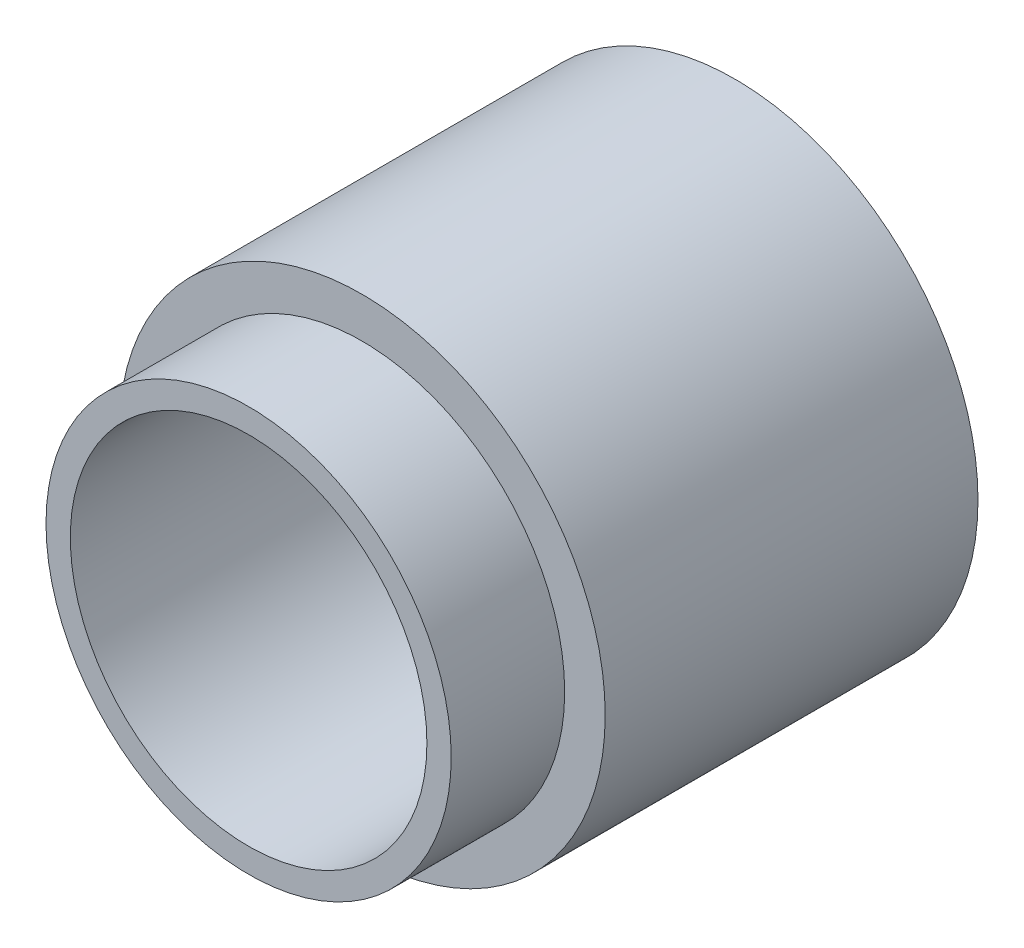
ISO-10303-21;
HEADER;
FILE_DESCRIPTION(('STEP AP214'),'2;1');
FILE_NAME('part.step','',(''),(''),'','','');
FILE_SCHEMA(('AUTOMOTIVE_DESIGN { 1 0 10303 214 1 1 1 1 }'));
ENDSEC;
DATA;
#1=APPLICATION_CONTEXT('core data for automotive mechanical design processes');
#2=APPLICATION_PROTOCOL_DEFINITION('international standard','automotive_design',2000,#1);
#3=PRODUCT_CONTEXT('',#1,'mechanical');
#4=PRODUCT('Part','Part','',(#3));
#5=PRODUCT_RELATED_PRODUCT_CATEGORY('part','',(#4));
#6=PRODUCT_DEFINITION_FORMATION('','',#4);
#7=PRODUCT_DEFINITION_CONTEXT('part definition',#1,'design');
#8=PRODUCT_DEFINITION('design','',#6,#7);
#9=PRODUCT_DEFINITION_SHAPE('','',#8);
#10=(LENGTH_UNIT() NAMED_UNIT(*) SI_UNIT(.MILLI.,.METRE.));
#11=(NAMED_UNIT(*) PLANE_ANGLE_UNIT() SI_UNIT($,.RADIAN.));
#12=(NAMED_UNIT(*) SI_UNIT($,.STERADIAN.) SOLID_ANGLE_UNIT());
#13=UNCERTAINTY_MEASURE_WITH_UNIT(LENGTH_MEASURE(1.E-05),#10,'distance_accuracy_value','');
#14=(GEOMETRIC_REPRESENTATION_CONTEXT(3) GLOBAL_UNCERTAINTY_ASSIGNED_CONTEXT((#13)) GLOBAL_UNIT_ASSIGNED_CONTEXT((#10,
#11,#12)) REPRESENTATION_CONTEXT('',''));
#15=CARTESIAN_POINT('',(0.,0.,0.));
#16=DIRECTION('',(0.,0.,1.));
#17=DIRECTION('',(1.,0.,0.));
#18=AXIS2_PLACEMENT_3D('',#15,#16,#17);
#19=CARTESIAN_POINT('',(0.,0.,30.));
#20=DIRECTION('',(0.,0.,1.));
#21=DIRECTION('',(1.,0.,0.));
#22=AXIS2_PLACEMENT_3D('',#19,#20,#21);
#23=PLANE('',#22);
#24=CARTESIAN_POINT('',(0.,0.,30.));
#25=DIRECTION('',(0.,0.,1.));
#26=DIRECTION('',(1.,0.,0.));
#27=AXIS2_PLACEMENT_3D('',#24,#25,#26);
#28=CIRCLE('',#27,12.5);
#29=CARTESIAN_POINT('',(12.5,0.,30.));
#30=VERTEX_POINT('',#29);
#31=EDGE_CURVE('E10',#30,#30,#28,.T.);
#32=ORIENTED_EDGE('',*,*,#31,.T.);
#33=EDGE_LOOP('',(#32));
#34=FACE_BOUND('',#33,.T.);
#35=CARTESIAN_POINT('',(0.,0.,30.));
#36=DIRECTION('',(0.,0.,1.));
#37=DIRECTION('',(1.,0.,0.));
#38=AXIS2_PLACEMENT_3D('',#35,#36,#37);
#39=CIRCLE('',#38,11.);
#40=CARTESIAN_POINT('',(11.,0.,30.));
#41=VERTEX_POINT('',#40);
#42=EDGE_CURVE('E38',#41,#41,#39,.T.);
#43=ORIENTED_EDGE('',*,*,#42,.F.);
#44=EDGE_LOOP('',(#43));
#45=FACE_BOUND('',#44,.T.);
#46=ADVANCED_FACE('F31',(#34,#45),#23,.T.);
#47=CARTESIAN_POINT('',(0.,0.,0.));
#48=DIRECTION('',(0.,0.,1.));
#49=DIRECTION('',(1.,0.,0.));
#50=AXIS2_PLACEMENT_3D('',#47,#48,#49);
#51=PLANE('',#50);
#52=CARTESIAN_POINT('',(0.,0.,0.));
#53=DIRECTION('',(0.,0.,1.));
#54=DIRECTION('',(1.,0.,0.));
#55=AXIS2_PLACEMENT_3D('',#52,#53,#54);
#56=CIRCLE('',#55,11.);
#57=CARTESIAN_POINT('',(11.,0.,0.));
#58=VERTEX_POINT('',#57);
#59=EDGE_CURVE('E42',#58,#58,#56,.T.);
#60=ORIENTED_EDGE('',*,*,#59,.T.);
#61=EDGE_LOOP('',(#60));
#62=FACE_BOUND('',#61,.T.);
#63=CARTESIAN_POINT('',(0.,0.,0.));
#64=DIRECTION('',(0.,0.,1.));
#65=DIRECTION('',(1.,0.,0.));
#66=AXIS2_PLACEMENT_3D('',#63,#64,#65);
#67=CIRCLE('',#66,15.);
#68=CARTESIAN_POINT('',(15.,0.,0.));
#69=VERTEX_POINT('',#68);
#70=EDGE_CURVE('E47',#69,#69,#67,.F.);
#71=ORIENTED_EDGE('',*,*,#70,.T.);
#72=EDGE_LOOP('',(#71));
#73=FACE_BOUND('',#72,.T.);
#74=ADVANCED_FACE('F58',(#62,#73),#51,.F.);
#75=CARTESIAN_POINT('',(0.,0.,30.));
#76=DIRECTION('',(0.,0.,-1.));
#77=DIRECTION('',(-1.,0.,0.));
#78=AXIS2_PLACEMENT_3D('',#75,#76,#77);
#79=CYLINDRICAL_SURFACE('',#78,12.5);
#80=CARTESIAN_POINT('',(0.,0.,23.));
#81=DIRECTION('',(0.,0.,1.));
#82=DIRECTION('',(1.,0.,0.));
#83=AXIS2_PLACEMENT_3D('',#80,#81,#82);
#84=CIRCLE('',#83,12.5);
#85=CARTESIAN_POINT('',(12.5,0.,23.));
#86=VERTEX_POINT('',#85);
#87=EDGE_CURVE('E52',#86,#86,#84,.T.);
#88=ORIENTED_EDGE('',*,*,#87,.T.);
#89=EDGE_LOOP('',(#88));
#90=FACE_BOUND('',#89,.T.);
#91=ORIENTED_EDGE('',*,*,#31,.F.);
#92=EDGE_LOOP('',(#91));
#93=FACE_BOUND('',#92,.T.);
#94=ADVANCED_FACE('F33',(#90,#93),#79,.T.);
#95=CARTESIAN_POINT('',(0.,0.,30.));
#96=DIRECTION('',(0.,0.,-1.));
#97=DIRECTION('',(-1.,0.,0.));
#98=AXIS2_PLACEMENT_3D('',#95,#96,#97);
#99=CYLINDRICAL_SURFACE('',#98,11.);
#100=ORIENTED_EDGE('',*,*,#42,.T.);
#101=EDGE_LOOP('',(#100));
#102=FACE_BOUND('',#101,.T.);
#103=ORIENTED_EDGE('',*,*,#59,.F.);
#104=EDGE_LOOP('',(#103));
#105=FACE_BOUND('',#104,.T.);
#106=ADVANCED_FACE('F64',(#102,#105),#99,.F.);
#107=CARTESIAN_POINT('',(0.,0.,-42.4264068711929));
#108=DIRECTION('',(0.,0.,1.));
#109=DIRECTION('',(1.,0.,0.));
#110=AXIS2_PLACEMENT_3D('',#107,#108,#109);
#111=CYLINDRICAL_SURFACE('',#110,15.);
#112=ORIENTED_EDGE('',*,*,#70,.F.);
#113=EDGE_LOOP('',(#112));
#114=FACE_BOUND('',#113,.T.);
#115=CARTESIAN_POINT('',(0.,0.,23.));
#116=DIRECTION('',(0.,0.,1.));
#117=DIRECTION('',(1.,0.,0.));
#118=AXIS2_PLACEMENT_3D('',#115,#116,#117);
#119=CIRCLE('',#118,15.);
#120=CARTESIAN_POINT('',(15.,0.,23.));
#121=VERTEX_POINT('',#120);
#122=EDGE_CURVE('E49',#121,#121,#119,.T.);
#123=ORIENTED_EDGE('',*,*,#122,.F.);
#124=EDGE_LOOP('',(#123));
#125=FACE_BOUND('',#124,.T.);
#126=ADVANCED_FACE('F60',(#114,#125),#111,.T.);
#127=CARTESIAN_POINT('',(0.,0.,23.));
#128=DIRECTION('',(0.,0.,1.));
#129=DIRECTION('',(1.,0.,0.));
#130=AXIS2_PLACEMENT_3D('',#127,#128,#129);
#131=PLANE('',#130);
#132=ORIENTED_EDGE('',*,*,#87,.F.);
#133=EDGE_LOOP('',(#132));
#134=FACE_BOUND('',#133,.T.);
#135=ORIENTED_EDGE('',*,*,#122,.T.);
#136=EDGE_LOOP('',(#135));
#137=FACE_BOUND('',#136,.T.);
#138=ADVANCED_FACE('F63',(#134,#137),#131,.T.);
#139=CLOSED_SHELL('',(#46,#74,#94,#106,#126,#138));
#140=MANIFOLD_SOLID_BREP('B2',#139);
#141=ADVANCED_BREP_SHAPE_REPRESENTATION('',(#18,#140),#14);
#142=SHAPE_DEFINITION_REPRESENTATION(#9,#141);
ENDSEC;
END-ISO-10303-21;
